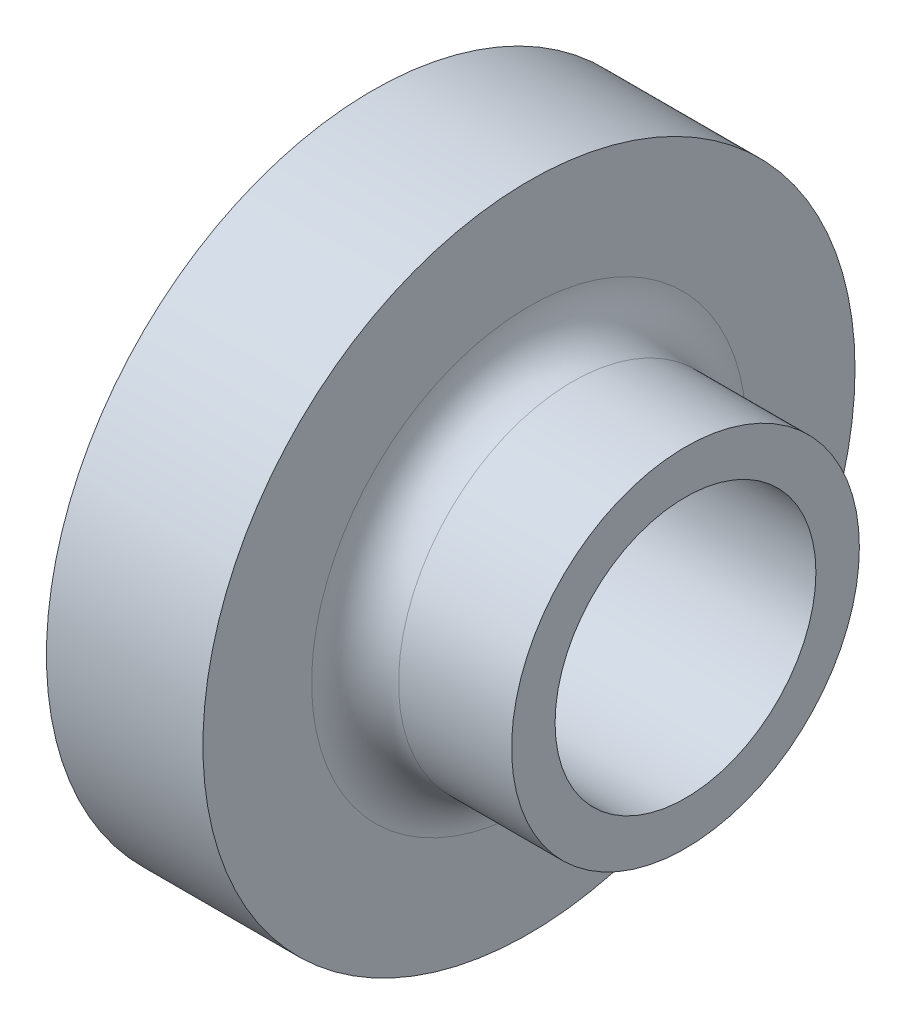
ISO-10303-21;
HEADER;
FILE_DESCRIPTION(('STEP AP214'),'2;1');
FILE_NAME('part.step','',(''),(''),'','','');
FILE_SCHEMA(('AUTOMOTIVE_DESIGN { 1 0 10303 214 1 1 1 1 }'));
ENDSEC;
DATA;
#1=APPLICATION_CONTEXT('core data for automotive mechanical design processes');
#2=APPLICATION_PROTOCOL_DEFINITION('international standard','automotive_design',2000,#1);
#3=PRODUCT_CONTEXT('',#1,'mechanical');
#4=PRODUCT('Part','Part','',(#3));
#5=PRODUCT_RELATED_PRODUCT_CATEGORY('part','',(#4));
#6=PRODUCT_DEFINITION_FORMATION('','',#4);
#7=PRODUCT_DEFINITION_CONTEXT('part definition',#1,'design');
#8=PRODUCT_DEFINITION('design','',#6,#7);
#9=PRODUCT_DEFINITION_SHAPE('','',#8);
#10=(LENGTH_UNIT() NAMED_UNIT(*) SI_UNIT(.MILLI.,.METRE.));
#11=(NAMED_UNIT(*) PLANE_ANGLE_UNIT() SI_UNIT($,.RADIAN.));
#12=(NAMED_UNIT(*) SI_UNIT($,.STERADIAN.) SOLID_ANGLE_UNIT());
#13=UNCERTAINTY_MEASURE_WITH_UNIT(LENGTH_MEASURE(1.E-05),#10,'distance_accuracy_value','');
#14=(GEOMETRIC_REPRESENTATION_CONTEXT(3) GLOBAL_UNCERTAINTY_ASSIGNED_CONTEXT((#13)) GLOBAL_UNIT_ASSIGNED_CONTEXT((#10,
#11,#12)) REPRESENTATION_CONTEXT('',''));
#15=CARTESIAN_POINT('',(0.,0.,0.));
#16=DIRECTION('',(0.,0.,1.));
#17=DIRECTION('',(1.,0.,0.));
#18=AXIS2_PLACEMENT_3D('',#15,#16,#17);
#19=CARTESIAN_POINT('',(13.9591260526521,15.,0.));
#20=DIRECTION('',(-1.,0.,0.));
#21=DIRECTION('',(0.,0.,1.));
#22=AXIS2_PLACEMENT_3D('',#19,#20,#21);
#23=PLANE('',#22);
#24=CARTESIAN_POINT('',(13.9591260526521,0.,0.));
#25=DIRECTION('',(1.,0.,0.));
#26=DIRECTION('',(0.,0.,-1.));
#27=AXIS2_PLACEMENT_3D('',#24,#25,#26);
#28=CIRCLE('',#27,15.);
#29=CARTESIAN_POINT('',(13.9591260526521,0.,-15.));
#30=VERTEX_POINT('',#29);
#31=EDGE_CURVE('E68',#30,#30,#28,.T.);
#32=ORIENTED_EDGE('',*,*,#31,.T.);
#33=EDGE_LOOP('',(#32));
#34=FACE_BOUND('',#33,.T.);
#35=CARTESIAN_POINT('',(13.9591260526521,0.,0.));
#36=DIRECTION('',(1.,0.,0.));
#37=DIRECTION('',(0.,0.,-1.));
#38=AXIS2_PLACEMENT_3D('',#35,#36,#37);
#39=CIRCLE('',#38,37.5);
#40=CARTESIAN_POINT('',(13.9591260526521,0.,-37.5));
#41=VERTEX_POINT('',#40);
#42=EDGE_CURVE('E49',#41,#41,#39,.T.);
#43=ORIENTED_EDGE('',*,*,#42,.F.);
#44=EDGE_LOOP('',(#43));
#45=FACE_BOUND('',#44,.T.);
#46=ADVANCED_FACE('F36',(#34,#45),#23,.T.);
#47=CARTESIAN_POINT('',(66.865858879555,0.,0.));
#48=DIRECTION('',(1.,0.,0.));
#49=DIRECTION('',(0.,0.,-1.));
#50=AXIS2_PLACEMENT_3D('',#47,#48,#49);
#51=CYLINDRICAL_SURFACE('',#50,37.5);
#52=ORIENTED_EDGE('',*,*,#42,.T.);
#53=EDGE_LOOP('',(#52));
#54=FACE_BOUND('',#53,.T.);
#55=CARTESIAN_POINT('',(31.9591260526521,0.,0.));
#56=DIRECTION('',(1.,0.,0.));
#57=DIRECTION('',(0.,0.,-1.));
#58=AXIS2_PLACEMENT_3D('',#55,#56,#57);
#59=CIRCLE('',#58,37.5);
#60=CARTESIAN_POINT('',(31.9591260526521,0.,-37.5));
#61=VERTEX_POINT('',#60);
#62=EDGE_CURVE('E54',#61,#61,#59,.T.);
#63=ORIENTED_EDGE('',*,*,#62,.F.);
#64=EDGE_LOOP('',(#63));
#65=FACE_BOUND('',#64,.T.);
#66=ADVANCED_FACE('F89',(#54,#65),#51,.T.);
#67=CARTESIAN_POINT('',(31.9591260526521,37.5,0.));
#68=DIRECTION('',(1.,0.,0.));
#69=DIRECTION('',(0.,0.,-1.));
#70=AXIS2_PLACEMENT_3D('',#67,#68,#69);
#71=PLANE('',#70);
#72=CARTESIAN_POINT('',(31.9591260526521,0.,0.));
#73=DIRECTION('',(1.,0.,0.));
#74=DIRECTION('',(0.,0.,-1.));
#75=AXIS2_PLACEMENT_3D('',#72,#73,#74);
#76=CIRCLE('',#75,25.);
#77=CARTESIAN_POINT('',(31.9591260526521,0.,-25.));
#78=VERTEX_POINT('',#77);
#79=EDGE_CURVE('E10',#78,#78,#76,.F.);
#80=ORIENTED_EDGE('',*,*,#79,.T.);
#81=EDGE_LOOP('',(#80));
#82=FACE_BOUND('',#81,.T.);
#83=ORIENTED_EDGE('',*,*,#62,.T.);
#84=EDGE_LOOP('',(#83));
#85=FACE_BOUND('',#84,.T.);
#86=ADVANCED_FACE('F93',(#82,#85),#71,.T.);
#87=CARTESIAN_POINT('',(66.865858879555,0.,0.));
#88=DIRECTION('',(1.,0.,0.));
#89=DIRECTION('',(0.,0.,-1.));
#90=AXIS2_PLACEMENT_3D('',#87,#88,#89);
#91=CYLINDRICAL_SURFACE('',#90,20.);
#92=CARTESIAN_POINT('',(36.9591260526521,0.,0.));
#93=DIRECTION('',(1.,0.,0.));
#94=DIRECTION('',(0.,0.,-1.));
#95=AXIS2_PLACEMENT_3D('',#92,#93,#94);
#96=CIRCLE('',#95,20.);
#97=CARTESIAN_POINT('',(36.9591260526521,0.,-20.));
#98=VERTEX_POINT('',#97);
#99=EDGE_CURVE('E44',#98,#98,#96,.T.);
#100=ORIENTED_EDGE('',*,*,#99,.T.);
#101=EDGE_LOOP('',(#100));
#102=FACE_BOUND('',#101,.T.);
#103=CARTESIAN_POINT('',(49.9591361561849,0.,0.));
#104=DIRECTION('',(1.,0.,0.));
#105=DIRECTION('',(0.,0.,-1.));
#106=AXIS2_PLACEMENT_3D('',#103,#104,#105);
#107=CIRCLE('',#106,20.);
#108=CARTESIAN_POINT('',(49.9591361561849,0.,-20.));
#109=VERTEX_POINT('',#108);
#110=EDGE_CURVE('E60',#109,#109,#107,.T.);
#111=ORIENTED_EDGE('',*,*,#110,.F.);
#112=EDGE_LOOP('',(#111));
#113=FACE_BOUND('',#112,.T.);
#114=ADVANCED_FACE('F85',(#102,#113),#91,.T.);
#115=CARTESIAN_POINT('',(49.9591361561849,20.,0.));
#116=DIRECTION('',(1.,0.,0.));
#117=DIRECTION('',(0.,0.,-1.));
#118=AXIS2_PLACEMENT_3D('',#115,#116,#117);
#119=PLANE('',#118);
#120=ORIENTED_EDGE('',*,*,#110,.T.);
#121=EDGE_LOOP('',(#120));
#122=FACE_BOUND('',#121,.T.);
#123=CARTESIAN_POINT('',(49.9591361561849,0.,0.));
#124=DIRECTION('',(1.,0.,0.));
#125=DIRECTION('',(0.,0.,-1.));
#126=AXIS2_PLACEMENT_3D('',#123,#124,#125);
#127=CIRCLE('',#126,15.);
#128=CARTESIAN_POINT('',(49.9591361561849,0.,-15.));
#129=VERTEX_POINT('',#128);
#130=EDGE_CURVE('E64',#129,#129,#127,.T.);
#131=ORIENTED_EDGE('',*,*,#130,.F.);
#132=EDGE_LOOP('',(#131));
#133=FACE_BOUND('',#132,.T.);
#134=ADVANCED_FACE('F77',(#122,#133),#119,.T.);
#135=CARTESIAN_POINT('',(66.865858879555,0.,0.));
#136=DIRECTION('',(1.,0.,0.));
#137=DIRECTION('',(0.,0.,-1.));
#138=AXIS2_PLACEMENT_3D('',#135,#136,#137);
#139=CYLINDRICAL_SURFACE('',#138,15.);
#140=ORIENTED_EDGE('',*,*,#130,.T.);
#141=EDGE_LOOP('',(#140));
#142=FACE_BOUND('',#141,.T.);
#143=ORIENTED_EDGE('',*,*,#31,.F.);
#144=EDGE_LOOP('',(#143));
#145=FACE_BOUND('',#144,.T.);
#146=ADVANCED_FACE('F75',(#142,#145),#139,.F.);
#147=CARTESIAN_POINT('',(36.9591260526521,0.,0.));
#148=DIRECTION('',(1.,0.,0.));
#149=DIRECTION('',(0.,0.,-1.));
#150=AXIS2_PLACEMENT_3D('',#147,#148,#149);
#151=TOROIDAL_SURFACE('',#150,25.,5.);
#152=ORIENTED_EDGE('',*,*,#79,.F.);
#153=EDGE_LOOP('',(#152));
#154=FACE_BOUND('',#153,.T.);
#155=ORIENTED_EDGE('',*,*,#99,.F.);
#156=EDGE_LOOP('',(#155));
#157=FACE_BOUND('',#156,.T.);
#158=ADVANCED_FACE('F38',(#154,#157),#151,.F.);
#159=CLOSED_SHELL('',(#46,#66,#86,#114,#134,#146,#158));
#160=MANIFOLD_SOLID_BREP('B2',#159);
#161=ADVANCED_BREP_SHAPE_REPRESENTATION('',(#18,#160),#14);
#162=SHAPE_DEFINITION_REPRESENTATION(#9,#161);
ENDSEC;
END-ISO-10303-21;
